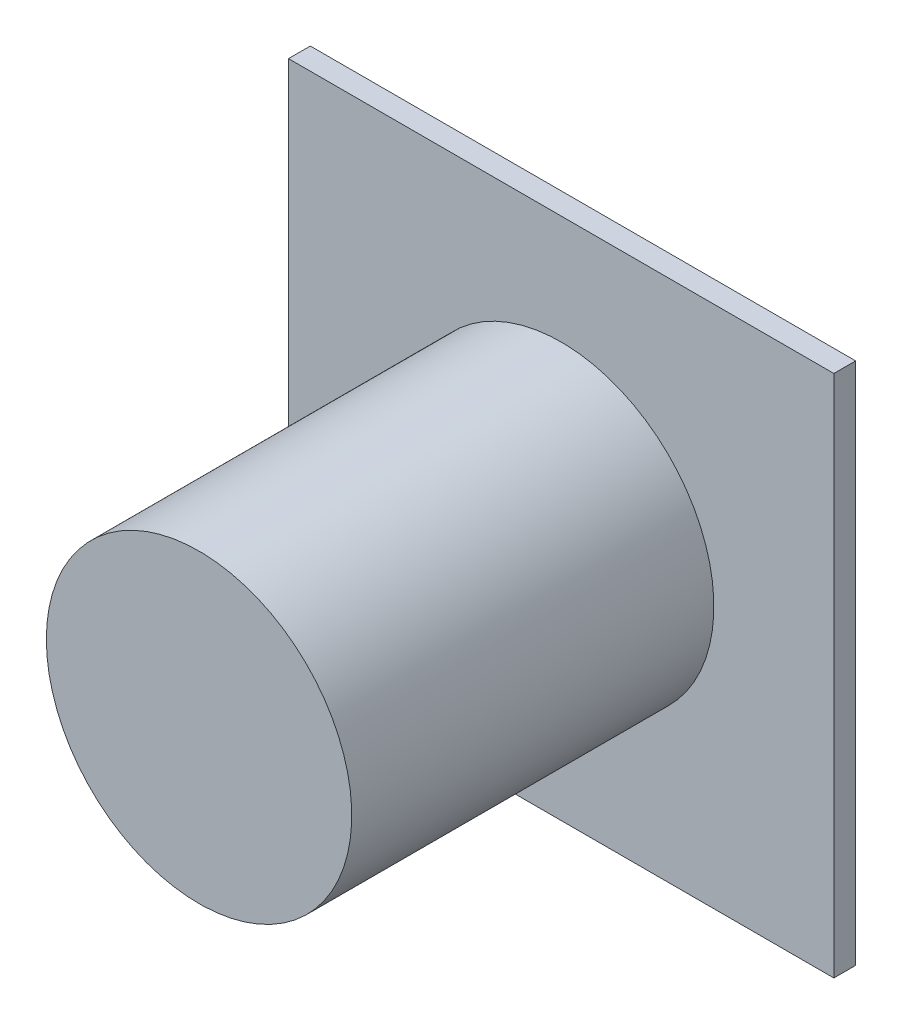
ISO-10303-21;
HEADER;
FILE_DESCRIPTION(('STEP AP214'),'2;1');
FILE_NAME('part.step','',(''),(''),'','','');
FILE_SCHEMA(('AUTOMOTIVE_DESIGN { 1 0 10303 214 1 1 1 1 }'));
ENDSEC;
DATA;
#1=APPLICATION_CONTEXT('core data for automotive mechanical design processes');
#2=APPLICATION_PROTOCOL_DEFINITION('international standard','automotive_design',2000,#1);
#3=PRODUCT_CONTEXT('',#1,'mechanical');
#4=PRODUCT('Part','Part','',(#3));
#5=PRODUCT_RELATED_PRODUCT_CATEGORY('part','',(#4));
#6=PRODUCT_DEFINITION_FORMATION('','',#4);
#7=PRODUCT_DEFINITION_CONTEXT('part definition',#1,'design');
#8=PRODUCT_DEFINITION('design','',#6,#7);
#9=PRODUCT_DEFINITION_SHAPE('','',#8);
#10=(LENGTH_UNIT() NAMED_UNIT(*) SI_UNIT(.MILLI.,.METRE.));
#11=(NAMED_UNIT(*) PLANE_ANGLE_UNIT() SI_UNIT($,.RADIAN.));
#12=(NAMED_UNIT(*) SI_UNIT($,.STERADIAN.) SOLID_ANGLE_UNIT());
#13=UNCERTAINTY_MEASURE_WITH_UNIT(LENGTH_MEASURE(1.E-05),#10,'distance_accuracy_value','');
#14=(GEOMETRIC_REPRESENTATION_CONTEXT(3) GLOBAL_UNCERTAINTY_ASSIGNED_CONTEXT((#13)) GLOBAL_UNIT_ASSIGNED_CONTEXT((#10,
#11,#12)) REPRESENTATION_CONTEXT('',''));
#15=CARTESIAN_POINT('',(0.,0.,0.));
#16=DIRECTION('',(0.,0.,1.));
#17=DIRECTION('',(1.,0.,0.));
#18=AXIS2_PLACEMENT_3D('',#15,#16,#17);
#19=CARTESIAN_POINT('',(-12.5,-12.,1.));
#20=DIRECTION('',(1.,0.,0.));
#21=DIRECTION('',(0.,0.,-1.));
#22=AXIS2_PLACEMENT_3D('',#19,#20,#21);
#23=PLANE('',#22);
#24=DIRECTION('',(0.,-1.,0.));
#25=VECTOR('',#24,1.);
#26=CARTESIAN_POINT('',(-12.5,-12.,0.));
#27=LINE('',#26,#25);
#28=CARTESIAN_POINT('',(-12.5,12.,0.));
#29=VERTEX_POINT('',#28);
#30=CARTESIAN_POINT('',(-12.5,-12.,0.));
#31=VERTEX_POINT('',#30);
#32=EDGE_CURVE('E118',#29,#31,#27,.T.);
#33=ORIENTED_EDGE('',*,*,#32,.T.);
#34=DIRECTION('',(0.,0.,-1.));
#35=VECTOR('',#34,1.);
#36=CARTESIAN_POINT('',(-12.5,-12.,1.));
#37=LINE('',#36,#35);
#38=CARTESIAN_POINT('',(-12.5,-12.,1.));
#39=VERTEX_POINT('',#38);
#40=EDGE_CURVE('E48',#39,#31,#37,.T.);
#41=ORIENTED_EDGE('',*,*,#40,.F.);
#42=DIRECTION('',(0.,-1.,0.));
#43=VECTOR('',#42,1.);
#44=CARTESIAN_POINT('',(-12.5,-12.,1.));
#45=LINE('',#44,#43);
#46=CARTESIAN_POINT('',(-12.5,12.,1.));
#47=VERTEX_POINT('',#46);
#48=EDGE_CURVE('E97',#47,#39,#45,.T.);
#49=ORIENTED_EDGE('',*,*,#48,.F.);
#50=DIRECTION('',(0.,0.,-1.));
#51=VECTOR('',#50,1.);
#52=CARTESIAN_POINT('',(-12.5,12.,1.));
#53=LINE('',#52,#51);
#54=EDGE_CURVE('E115',#47,#29,#53,.T.);
#55=ORIENTED_EDGE('',*,*,#54,.T.);
#56=EDGE_LOOP('',(#33,#41,#49,#55));
#57=FACE_BOUND('',#56,.T.);
#58=ADVANCED_FACE('F44',(#57),#23,.F.);
#59=CARTESIAN_POINT('',(-12.5,-12.,1.));
#60=DIRECTION('',(0.,1.,0.));
#61=DIRECTION('',(0.,0.,1.));
#62=AXIS2_PLACEMENT_3D('',#59,#60,#61);
#63=PLANE('',#62);
#64=DIRECTION('',(1.,0.,0.));
#65=VECTOR('',#64,1.);
#66=CARTESIAN_POINT('',(-12.5,-12.,0.));
#67=LINE('',#66,#65);
#68=CARTESIAN_POINT('',(12.5,-12.,0.));
#69=VERTEX_POINT('',#68);
#70=EDGE_CURVE('E104',#31,#69,#67,.T.);
#71=ORIENTED_EDGE('',*,*,#70,.T.);
#72=DIRECTION('',(0.,0.,-1.));
#73=VECTOR('',#72,1.);
#74=CARTESIAN_POINT('',(12.5,-12.,1.));
#75=LINE('',#74,#73);
#76=CARTESIAN_POINT('',(12.5,-12.,1.));
#77=VERTEX_POINT('',#76);
#78=EDGE_CURVE('E103',#77,#69,#75,.T.);
#79=ORIENTED_EDGE('',*,*,#78,.F.);
#80=DIRECTION('',(1.,0.,0.));
#81=VECTOR('',#80,1.);
#82=CARTESIAN_POINT('',(-12.5,-12.,1.));
#83=LINE('',#82,#81);
#84=EDGE_CURVE('E94',#39,#77,#83,.T.);
#85=ORIENTED_EDGE('',*,*,#84,.F.);
#86=ORIENTED_EDGE('',*,*,#40,.T.);
#87=EDGE_LOOP('',(#71,#79,#85,#86));
#88=FACE_BOUND('',#87,.T.);
#89=ADVANCED_FACE('F102',(#88),#63,.F.);
#90=CARTESIAN_POINT('',(12.5,-12.,1.));
#91=DIRECTION('',(-1.,0.,0.));
#92=DIRECTION('',(0.,0.,1.));
#93=AXIS2_PLACEMENT_3D('',#90,#91,#92);
#94=PLANE('',#93);
#95=DIRECTION('',(0.,1.,0.));
#96=VECTOR('',#95,1.);
#97=CARTESIAN_POINT('',(12.5,-12.,0.));
#98=LINE('',#97,#96);
#99=CARTESIAN_POINT('',(12.5,12.,0.));
#100=VERTEX_POINT('',#99);
#101=EDGE_CURVE('E76',#69,#100,#98,.T.);
#102=ORIENTED_EDGE('',*,*,#101,.T.);
#103=DIRECTION('',(0.,0.,-1.));
#104=VECTOR('',#103,1.);
#105=CARTESIAN_POINT('',(12.5,12.,1.));
#106=LINE('',#105,#104);
#107=CARTESIAN_POINT('',(12.5,12.,1.));
#108=VERTEX_POINT('',#107);
#109=EDGE_CURVE('E110',#108,#100,#106,.T.);
#110=ORIENTED_EDGE('',*,*,#109,.F.);
#111=DIRECTION('',(0.,1.,0.));
#112=VECTOR('',#111,1.);
#113=CARTESIAN_POINT('',(12.5,-12.,1.));
#114=LINE('',#113,#112);
#115=EDGE_CURVE('E100',#77,#108,#114,.T.);
#116=ORIENTED_EDGE('',*,*,#115,.F.);
#117=ORIENTED_EDGE('',*,*,#78,.T.);
#118=EDGE_LOOP('',(#102,#110,#116,#117));
#119=FACE_BOUND('',#118,.T.);
#120=ADVANCED_FACE('F107',(#119),#94,.F.);
#121=CARTESIAN_POINT('',(-12.5,12.,1.));
#122=DIRECTION('',(0.,-1.,0.));
#123=DIRECTION('',(0.,0.,-1.));
#124=AXIS2_PLACEMENT_3D('',#121,#122,#123);
#125=PLANE('',#124);
#126=DIRECTION('',(-1.,0.,0.));
#127=VECTOR('',#126,1.);
#128=CARTESIAN_POINT('',(-12.5,12.,0.));
#129=LINE('',#128,#127);
#130=EDGE_CURVE('E88',#100,#29,#129,.T.);
#131=ORIENTED_EDGE('',*,*,#130,.T.);
#132=ORIENTED_EDGE('',*,*,#54,.F.);
#133=DIRECTION('',(-1.,0.,0.));
#134=VECTOR('',#133,1.);
#135=CARTESIAN_POINT('',(-12.5,12.,1.));
#136=LINE('',#135,#134);
#137=EDGE_CURVE('E62',#108,#47,#136,.T.);
#138=ORIENTED_EDGE('',*,*,#137,.F.);
#139=ORIENTED_EDGE('',*,*,#109,.T.);
#140=EDGE_LOOP('',(#131,#132,#138,#139));
#141=FACE_BOUND('',#140,.T.);
#142=ADVANCED_FACE('F128',(#141),#125,.F.);
#143=CARTESIAN_POINT('',(0.,0.,1.));
#144=DIRECTION('',(0.,0.,-1.));
#145=DIRECTION('',(-1.,0.,0.));
#146=AXIS2_PLACEMENT_3D('',#143,#144,#145);
#147=PLANE('',#146);
#148=CARTESIAN_POINT('',(0.,0.,1.));
#149=DIRECTION('',(0.,0.,1.));
#150=DIRECTION('',(1.,0.,0.));
#151=AXIS2_PLACEMENT_3D('',#148,#149,#150);
#152=CIRCLE('',#151,7.);
#153=CARTESIAN_POINT('',(-7.,0.,1.));
#154=VERTEX_POINT('',#153);
#155=EDGE_CURVE('E11',#154,#154,#152,.T.);
#156=ORIENTED_EDGE('',*,*,#155,.F.);
#157=EDGE_LOOP('',(#156));
#158=FACE_BOUND('',#157,.T.);
#159=ORIENTED_EDGE('',*,*,#48,.T.);
#160=ORIENTED_EDGE('',*,*,#84,.T.);
#161=ORIENTED_EDGE('',*,*,#115,.T.);
#162=ORIENTED_EDGE('',*,*,#137,.T.);
#163=EDGE_LOOP('',(#159,#160,#161,#162));
#164=FACE_BOUND('',#163,.T.);
#165=ADVANCED_FACE('F92',(#158,#164),#147,.F.);
#166=CARTESIAN_POINT('',(0.,0.,0.));
#167=DIRECTION('',(0.,0.,-1.));
#168=DIRECTION('',(-1.,0.,0.));
#169=AXIS2_PLACEMENT_3D('',#166,#167,#168);
#170=PLANE('',#169);
#171=ORIENTED_EDGE('',*,*,#32,.F.);
#172=ORIENTED_EDGE('',*,*,#130,.F.);
#173=ORIENTED_EDGE('',*,*,#101,.F.);
#174=ORIENTED_EDGE('',*,*,#70,.F.);
#175=EDGE_LOOP('',(#171,#172,#173,#174));
#176=FACE_BOUND('',#175,.T.);
#177=ADVANCED_FACE('F132',(#176),#170,.T.);
#178=CARTESIAN_POINT('',(0.,0.,17.6));
#179=DIRECTION('',(0.,0.,-1.));
#180=DIRECTION('',(-1.,0.,0.));
#181=AXIS2_PLACEMENT_3D('',#178,#179,#180);
#182=CYLINDRICAL_SURFACE('',#181,7.);
#183=CARTESIAN_POINT('',(0.,0.,17.6));
#184=DIRECTION('',(0.,0.,1.));
#185=DIRECTION('',(1.,0.,0.));
#186=AXIS2_PLACEMENT_3D('',#183,#184,#185);
#187=CIRCLE('',#186,7.);
#188=CARTESIAN_POINT('',(-7.,0.,17.6));
#189=VERTEX_POINT('',#188);
#190=EDGE_CURVE('E116',#189,#189,#187,.T.);
#191=CARTESIAN_POINT('',(-7.,0.,17.6));
#192=CARTESIAN_POINT('',(-7.,0.,17.4270833333333));
#193=CARTESIAN_POINT('',(-7.,0.,17.2541666666667));
#194=CARTESIAN_POINT('',(-7.,0.,16.9083333333333));
#195=CARTESIAN_POINT('',(-7.,0.,16.7354166666667));
#196=CARTESIAN_POINT('',(-7.,0.,16.3895833333333));
#197=CARTESIAN_POINT('',(-7.,0.,16.2166666666667));
#198=CARTESIAN_POINT('',(-7.,0.,15.8708333333333));
#199=CARTESIAN_POINT('',(-7.,0.,15.6979166666667));
#200=CARTESIAN_POINT('',(-7.,0.,15.3520833333333));
#201=CARTESIAN_POINT('',(-7.,0.,15.1791666666667));
#202=CARTESIAN_POINT('',(-7.,0.,14.8333333333333));
#203=CARTESIAN_POINT('',(-7.,0.,14.6604166666667));
#204=CARTESIAN_POINT('',(-7.,0.,14.3145833333333));
#205=CARTESIAN_POINT('',(-7.,0.,14.1416666666667));
#206=CARTESIAN_POINT('',(-7.,0.,13.7958333333333));
#207=CARTESIAN_POINT('',(-7.,0.,13.6229166666667));
#208=CARTESIAN_POINT('',(-7.,0.,13.2770833333333));
#209=CARTESIAN_POINT('',(-7.,0.,13.1041666666667));
#210=CARTESIAN_POINT('',(-7.,0.,12.7583333333333));
#211=CARTESIAN_POINT('',(-7.,0.,12.5854166666667));
#212=CARTESIAN_POINT('',(-7.,0.,12.2395833333333));
#213=CARTESIAN_POINT('',(-7.,0.,12.0666666666667));
#214=CARTESIAN_POINT('',(-7.,0.,11.7208333333333));
#215=CARTESIAN_POINT('',(-7.,0.,11.5479166666667));
#216=CARTESIAN_POINT('',(-7.,0.,11.2020833333333));
#217=CARTESIAN_POINT('',(-7.,0.,11.0291666666667));
#218=CARTESIAN_POINT('',(-7.,0.,10.6833333333333));
#219=CARTESIAN_POINT('',(-7.,0.,10.5104166666667));
#220=CARTESIAN_POINT('',(-7.,0.,10.1645833333333));
#221=CARTESIAN_POINT('',(-7.,0.,9.99166666666667));
#222=CARTESIAN_POINT('',(-7.,0.,9.64583333333333));
#223=CARTESIAN_POINT('',(-7.,0.,9.47291666666667));
#224=CARTESIAN_POINT('',(-7.,0.,9.12708333333333));
#225=CARTESIAN_POINT('',(-7.,0.,8.95416666666667));
#226=CARTESIAN_POINT('',(-7.,0.,8.60833333333333));
#227=CARTESIAN_POINT('',(-7.,0.,8.43541666666667));
#228=CARTESIAN_POINT('',(-7.,0.,8.08958333333333));
#229=CARTESIAN_POINT('',(-7.,0.,7.91666666666667));
#230=CARTESIAN_POINT('',(-7.,0.,7.57083333333333));
#231=CARTESIAN_POINT('',(-7.,0.,7.39791666666667));
#232=CARTESIAN_POINT('',(-7.,0.,7.05208333333333));
#233=CARTESIAN_POINT('',(-7.,0.,6.87916666666667));
#234=CARTESIAN_POINT('',(-7.,0.,6.53333333333333));
#235=CARTESIAN_POINT('',(-7.,0.,6.36041666666667));
#236=CARTESIAN_POINT('',(-7.,0.,6.01458333333333));
#237=CARTESIAN_POINT('',(-7.,0.,5.84166666666667));
#238=CARTESIAN_POINT('',(-7.,0.,5.49583333333333));
#239=CARTESIAN_POINT('',(-7.,0.,5.32291666666667));
#240=CARTESIAN_POINT('',(-7.,0.,4.97708333333334));
#241=CARTESIAN_POINT('',(-7.,0.,4.80416666666667));
#242=CARTESIAN_POINT('',(-7.,0.,4.45833333333333));
#243=CARTESIAN_POINT('',(-7.,0.,4.28541666666667));
#244=CARTESIAN_POINT('',(-7.,0.,3.93958333333333));
#245=CARTESIAN_POINT('',(-7.,0.,3.76666666666667));
#246=CARTESIAN_POINT('',(-7.,0.,3.42083333333333));
#247=CARTESIAN_POINT('',(-7.,0.,3.24791666666667));
#248=CARTESIAN_POINT('',(-7.,0.,2.90208333333333));
#249=CARTESIAN_POINT('',(-7.,0.,2.72916666666667));
#250=CARTESIAN_POINT('',(-7.,0.,2.38333333333333));
#251=CARTESIAN_POINT('',(-7.,0.,2.21041666666667));
#252=CARTESIAN_POINT('',(-7.,0.,1.86458333333333));
#253=CARTESIAN_POINT('',(-7.,0.,1.69166666666667));
#254=CARTESIAN_POINT('',(-7.,0.,1.34583333333333));
#255=CARTESIAN_POINT('',(-7.,0.,1.17291666666667));
#256=CARTESIAN_POINT('',(-7.,0.,1.));
#257=B_SPLINE_CURVE_WITH_KNOTS('',3,(#191,#192,#193,#194,#195,#196,#197,#198,#199,#200,#201,
#202,#203,#204,#205,#206,#207,#208,#209,#210,#211,#212,#213,#214,#215,#216,#217,#218,#219,#220,
#221,#222,#223,#224,#225,#226,#227,#228,#229,#230,#231,#232,#233,#234,#235,#236,#237,#238,#239,
#240,#241,#242,#243,#244,#245,#246,#247,#248,#249,#250,#251,#252,#253,#254,#255,#256),
.UNSPECIFIED.,.F.,.F.,(4,2,2,2,2,2,2,2,2,2,2,2,2,2,2,2,2,2,2,2,2,2,2,2,2,2,2,2,2,2,2,2,4),(0.,
0.518749999999998,1.0375,1.55625,2.075,2.59375,3.1125,3.63125,4.15,4.66875,5.1875,5.70625,6.225,
6.74375,7.2625,7.78125,8.3,8.81875,9.3375,9.85625,10.375,10.89375,11.4125,11.93125,12.45,
12.96875,13.4875,14.00625,14.525,15.04375,15.5625,16.08125,16.6),.UNSPECIFIED.);
#258=EDGE_CURVE('BSEAM141',#189,#154,#257,.T.);
#259=ORIENTED_EDGE('',*,*,#190,.F.);
#260=ORIENTED_EDGE('',*,*,#155,.T.);
#261=ORIENTED_EDGE('',*,*,#258,.T.);
#262=ORIENTED_EDGE('',*,*,#258,.F.);
#263=EDGE_LOOP('',(#259,#261,#260,#262));
#264=FACE_BOUND('',#263,.T.);
#265=ADVANCED_FACE('F141',(#264),#182,.T.);
#266=CARTESIAN_POINT('',(0.,0.,17.6));
#267=DIRECTION('',(0.,0.,1.));
#268=DIRECTION('',(1.,0.,0.));
#269=AXIS2_PLACEMENT_3D('',#266,#267,#268);
#270=PLANE('',#269);
#271=ORIENTED_EDGE('',*,*,#190,.T.);
#272=EDGE_LOOP('',(#271));
#273=FACE_BOUND('',#272,.T.);
#274=ADVANCED_FACE('F143',(#273),#270,.T.);
#275=CLOSED_SHELL('',(#58,#89,#120,#142,#165,#177,#265,#274));
#276=MANIFOLD_SOLID_BREP('B2',#275);
#277=ADVANCED_BREP_SHAPE_REPRESENTATION('',(#18,#276),#14);
#278=SHAPE_DEFINITION_REPRESENTATION(#9,#277);
ENDSEC;
END-ISO-10303-21;
